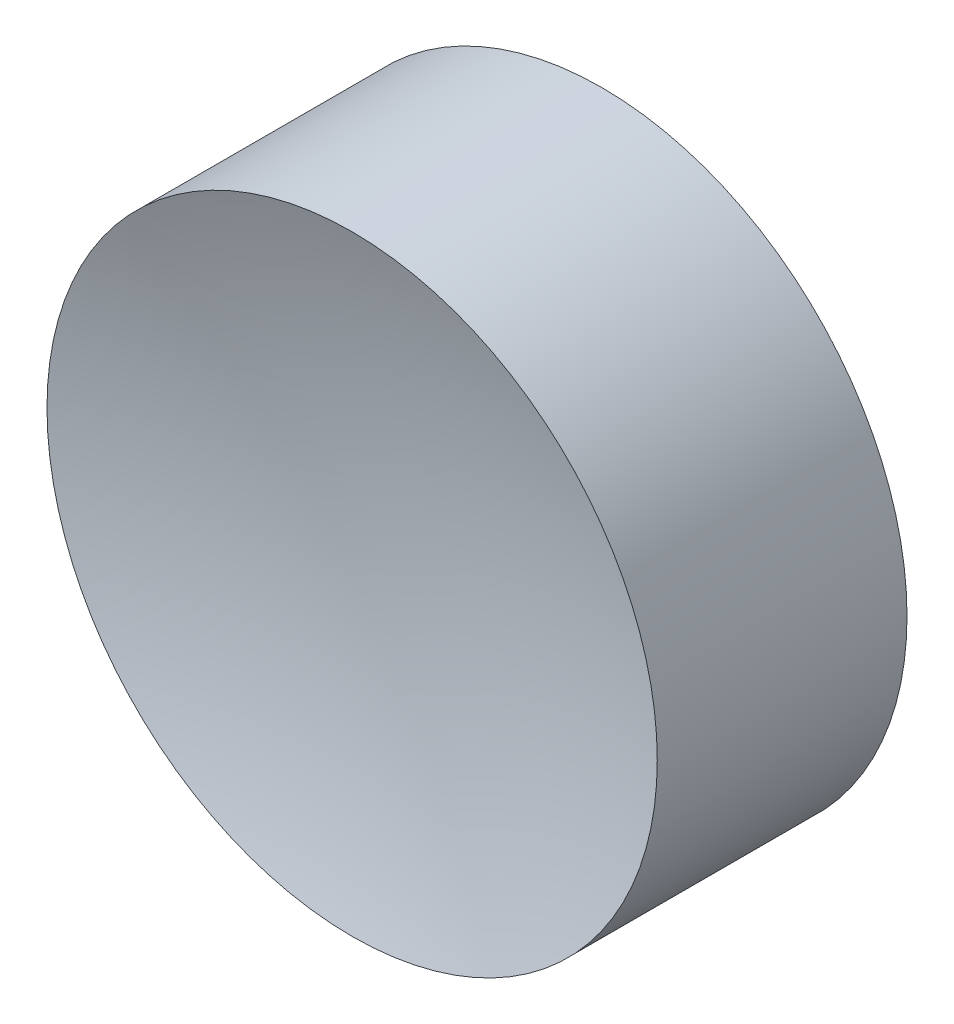
ISO-10303-21;
HEADER;
FILE_DESCRIPTION(('STEP AP214'),'2;1');
FILE_NAME('part.step','',(''),(''),'','','');
FILE_SCHEMA(('AUTOMOTIVE_DESIGN { 1 0 10303 214 1 1 1 1 }'));
ENDSEC;
DATA;
#1=APPLICATION_CONTEXT('core data for automotive mechanical design processes');
#2=APPLICATION_PROTOCOL_DEFINITION('international standard','automotive_design',2000,#1);
#3=PRODUCT_CONTEXT('',#1,'mechanical');
#4=PRODUCT('Part','Part','',(#3));
#5=PRODUCT_RELATED_PRODUCT_CATEGORY('part','',(#4));
#6=PRODUCT_DEFINITION_FORMATION('','',#4);
#7=PRODUCT_DEFINITION_CONTEXT('part definition',#1,'design');
#8=PRODUCT_DEFINITION('design','',#6,#7);
#9=PRODUCT_DEFINITION_SHAPE('','',#8);
#10=(LENGTH_UNIT() NAMED_UNIT(*) SI_UNIT(.MILLI.,.METRE.));
#11=(NAMED_UNIT(*) PLANE_ANGLE_UNIT() SI_UNIT($,.RADIAN.));
#12=(NAMED_UNIT(*) SI_UNIT($,.STERADIAN.) SOLID_ANGLE_UNIT());
#13=UNCERTAINTY_MEASURE_WITH_UNIT(LENGTH_MEASURE(1.E-05),#10,'distance_accuracy_value','');
#14=(GEOMETRIC_REPRESENTATION_CONTEXT(3) GLOBAL_UNCERTAINTY_ASSIGNED_CONTEXT((#13)) GLOBAL_UNIT_ASSIGNED_CONTEXT((#10,
#11,#12)) REPRESENTATION_CONTEXT('',''));
#15=CARTESIAN_POINT('',(0.,0.,0.));
#16=DIRECTION('',(0.,0.,1.));
#17=DIRECTION('',(1.,0.,0.));
#18=AXIS2_PLACEMENT_3D('',#15,#16,#17);
#19=CARTESIAN_POINT('',(0.,0.,-10.41));
#20=DIRECTION('',(0.,0.,1.));
#21=DIRECTION('',(1.,0.,0.));
#22=AXIS2_PLACEMENT_3D('',#19,#20,#21);
#23=SPHERICAL_SURFACE('',#22,9.66000000000001);
#24=CARTESIAN_POINT('',(0.,0.,-1.22764736028941));
#25=DIRECTION('',(0.,0.,1.));
#26=DIRECTION('',(1.,0.,0.));
#27=AXIS2_PLACEMENT_3D('',#24,#25,#26);
#28=CIRCLE('',#27,3.00000000000001);
#29=CARTESIAN_POINT('',(3.00000000000001,0.,-1.22764736028941));
#30=VERTEX_POINT('',#29);
#31=EDGE_CURVE('E10',#30,#30,#28,.T.);
#32=ORIENTED_EDGE('',*,*,#31,.F.);
#33=EDGE_LOOP('',(#32));
#34=FACE_BOUND('',#33,.T.);
#35=ADVANCED_FACE('F34',(#34),#23,.F.);
#36=CARTESIAN_POINT('',(0.,0.,-1.22764736028941));
#37=DIRECTION('',(0.,0.,1.));
#38=DIRECTION('',(1.,0.,0.));
#39=AXIS2_PLACEMENT_3D('',#36,#37,#38);
#40=CYLINDRICAL_SURFACE('',#39,3.00000000000001);
#41=ORIENTED_EDGE('',*,*,#31,.T.);
#42=EDGE_LOOP('',(#41));
#43=FACE_BOUND('',#42,.T.);
#44=CARTESIAN_POINT('',(0.,0.,1.22764736028941));
#45=DIRECTION('',(0.,0.,1.));
#46=DIRECTION('',(1.,0.,0.));
#47=AXIS2_PLACEMENT_3D('',#44,#45,#46);
#48=CIRCLE('',#47,3.00000000000001);
#49=CARTESIAN_POINT('',(3.00000000000001,0.,1.22764736028941));
#50=VERTEX_POINT('',#49);
#51=EDGE_CURVE('E40',#50,#50,#48,.T.);
#52=ORIENTED_EDGE('',*,*,#51,.F.);
#53=EDGE_LOOP('',(#52));
#54=FACE_BOUND('',#53,.T.);
#55=ADVANCED_FACE('F48',(#43,#54),#40,.T.);
#56=CARTESIAN_POINT('',(0.,0.,10.41));
#57=DIRECTION('',(0.,0.,1.));
#58=DIRECTION('',(1.,0.,0.));
#59=AXIS2_PLACEMENT_3D('',#56,#57,#58);
#60=SPHERICAL_SURFACE('',#59,9.66);
#61=ORIENTED_EDGE('',*,*,#51,.T.);
#62=EDGE_LOOP('',(#61));
#63=FACE_BOUND('',#62,.T.);
#64=ADVANCED_FACE('F46',(#63),#60,.F.);
#65=CLOSED_SHELL('',(#35,#55,#64));
#66=MANIFOLD_SOLID_BREP('B2',#65);
#67=ADVANCED_BREP_SHAPE_REPRESENTATION('',(#18,#66),#14);
#68=SHAPE_DEFINITION_REPRESENTATION(#9,#67);
ENDSEC;
END-ISO-10303-21;
